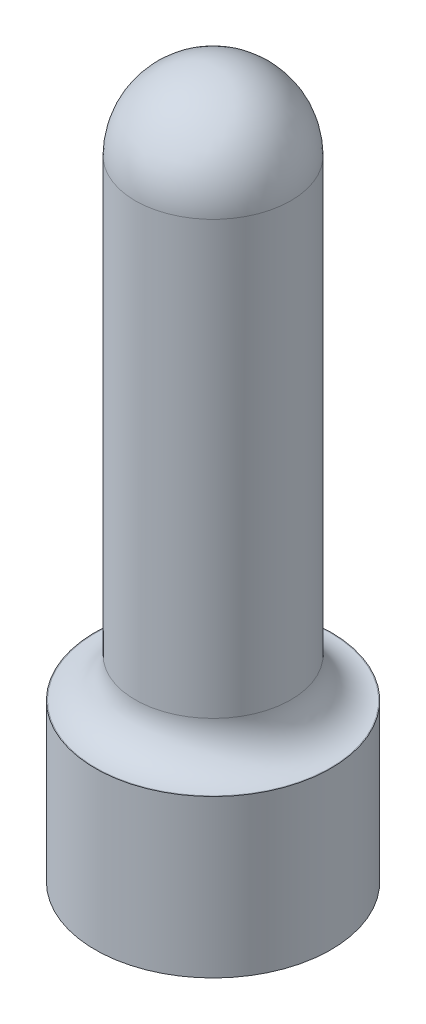
ISO-10303-21;
HEADER;
FILE_DESCRIPTION(('STEP AP214'),'2;1');
FILE_NAME('part.step','',(''),(''),'','','');
FILE_SCHEMA(('AUTOMOTIVE_DESIGN { 1 0 10303 214 1 1 1 1 }'));
ENDSEC;
DATA;
#1=APPLICATION_CONTEXT('core data for automotive mechanical design processes');
#2=APPLICATION_PROTOCOL_DEFINITION('international standard','automotive_design',2000,#1);
#3=PRODUCT_CONTEXT('',#1,'mechanical');
#4=PRODUCT('Part','Part','',(#3));
#5=PRODUCT_RELATED_PRODUCT_CATEGORY('part','',(#4));
#6=PRODUCT_DEFINITION_FORMATION('','',#4);
#7=PRODUCT_DEFINITION_CONTEXT('part definition',#1,'design');
#8=PRODUCT_DEFINITION('design','',#6,#7);
#9=PRODUCT_DEFINITION_SHAPE('','',#8);
#10=(LENGTH_UNIT() NAMED_UNIT(*) SI_UNIT(.MILLI.,.METRE.));
#11=(NAMED_UNIT(*) PLANE_ANGLE_UNIT() SI_UNIT($,.RADIAN.));
#12=(NAMED_UNIT(*) SI_UNIT($,.STERADIAN.) SOLID_ANGLE_UNIT());
#13=UNCERTAINTY_MEASURE_WITH_UNIT(LENGTH_MEASURE(1.E-05),#10,'distance_accuracy_value','');
#14=(GEOMETRIC_REPRESENTATION_CONTEXT(3) GLOBAL_UNCERTAINTY_ASSIGNED_CONTEXT((#13)) GLOBAL_UNIT_ASSIGNED_CONTEXT((#10,
#11,#12)) REPRESENTATION_CONTEXT('',''));
#15=CARTESIAN_POINT('',(0.,0.,0.));
#16=DIRECTION('',(0.,0.,1.));
#17=DIRECTION('',(1.,0.,0.));
#18=AXIS2_PLACEMENT_3D('',#15,#16,#17);
#19=CARTESIAN_POINT('',(0.,80.,0.));
#20=DIRECTION('',(0.,-1.,0.));
#21=DIRECTION('',(0.,0.,-1.));
#22=AXIS2_PLACEMENT_3D('',#19,#20,#21);
#23=CYLINDRICAL_SURFACE('',#22,9.9);
#24=CARTESIAN_POINT('',(0.,25.,0.));
#25=DIRECTION('',(0.,-1.,0.));
#26=DIRECTION('',(0.,0.,-1.));
#27=AXIS2_PLACEMENT_3D('',#24,#25,#26);
#28=CIRCLE('',#27,9.9);
#29=CARTESIAN_POINT('',(0.,25.,-9.9));
#30=VERTEX_POINT('',#29);
#31=EDGE_CURVE('E10',#30,#30,#28,.F.);
#32=ORIENTED_EDGE('',*,*,#31,.T.);
#33=EDGE_LOOP('',(#32));
#34=FACE_BOUND('',#33,.T.);
#35=CARTESIAN_POINT('',(0.,80.,0.));
#36=DIRECTION('',(0.,1.,0.));
#37=DIRECTION('',(0.,0.,1.));
#38=AXIS2_PLACEMENT_3D('',#35,#36,#37);
#39=CIRCLE('',#38,9.9);
#40=CARTESIAN_POINT('',(0.,80.,9.9));
#41=VERTEX_POINT('',#40);
#42=EDGE_CURVE('E47',#41,#41,#39,.T.);
#43=ORIENTED_EDGE('',*,*,#42,.F.);
#44=EDGE_LOOP('',(#43));
#45=FACE_BOUND('',#44,.T.);
#46=ADVANCED_FACE('F36',(#34,#45),#23,.T.);
#47=CARTESIAN_POINT('',(0.,80.,0.));
#48=DIRECTION('',(-1.,0.,0.));
#49=DIRECTION('',(0.,1.,0.));
#50=AXIS2_PLACEMENT_3D('',#47,#48,#49);
#51=SPHERICAL_SURFACE('',#50,9.9);
#52=CARTESIAN_POINT('',(0.,80.,0.));
#53=DIRECTION('',(0.,1.,0.));
#54=DIRECTION('',(0.,0.,1.));
#55=AXIS2_PLACEMENT_3D('',#52,#53,#54);
#56=SPHERICAL_SURFACE('',#55,9.9);
#57=ORIENTED_EDGE('',*,*,#42,.T.);
#58=EDGE_LOOP('',(#57));
#59=FACE_BOUND('',#58,.T.);
#60=ADVANCED_FACE('F73',(#59),#56,.T.);
#61=CARTESIAN_POINT('',(0.,20.,0.));
#62=DIRECTION('',(0.,-1.,0.));
#63=DIRECTION('',(0.,0.,-1.));
#64=AXIS2_PLACEMENT_3D('',#61,#62,#63);
#65=CYLINDRICAL_SURFACE('',#64,15.);
#66=CARTESIAN_POINT('',(0.,20.,0.));
#67=DIRECTION('',(0.,-1.,0.));
#68=DIRECTION('',(0.,0.,-1.));
#69=AXIS2_PLACEMENT_3D('',#66,#67,#68);
#70=CIRCLE('',#69,15.);
#71=CARTESIAN_POINT('',(0.,20.,-15.));
#72=VERTEX_POINT('',#71);
#73=EDGE_CURVE('E51',#72,#72,#70,.T.);
#74=ORIENTED_EDGE('',*,*,#73,.T.);
#75=EDGE_LOOP('',(#74));
#76=FACE_BOUND('',#75,.T.);
#77=CARTESIAN_POINT('',(0.,0.,0.));
#78=DIRECTION('',(0.,-1.,0.));
#79=DIRECTION('',(0.,0.,-1.));
#80=AXIS2_PLACEMENT_3D('',#77,#78,#79);
#81=CIRCLE('',#80,15.);
#82=CARTESIAN_POINT('',(0.,0.,-15.));
#83=VERTEX_POINT('',#82);
#84=EDGE_CURVE('E54',#83,#83,#81,.T.);
#85=ORIENTED_EDGE('',*,*,#84,.F.);
#86=EDGE_LOOP('',(#85));
#87=FACE_BOUND('',#86,.T.);
#88=ADVANCED_FACE('F60',(#76,#87),#65,.T.);
#89=CARTESIAN_POINT('',(0.,20.,0.));
#90=DIRECTION('',(0.,-1.,0.));
#91=DIRECTION('',(0.,0.,-1.));
#92=AXIS2_PLACEMENT_3D('',#89,#90,#91);
#93=PLANE('',#92);
#94=CARTESIAN_POINT('',(0.,20.,0.));
#95=DIRECTION('',(0.,-1.,0.));
#96=DIRECTION('',(0.,0.,-1.));
#97=AXIS2_PLACEMENT_3D('',#94,#95,#96);
#98=CIRCLE('',#97,14.9);
#99=CARTESIAN_POINT('',(0.,20.,-14.9));
#100=VERTEX_POINT('',#99);
#101=EDGE_CURVE('E43',#100,#100,#98,.T.);
#102=ORIENTED_EDGE('',*,*,#101,.T.);
#103=EDGE_LOOP('',(#102));
#104=FACE_BOUND('',#103,.T.);
#105=ORIENTED_EDGE('',*,*,#73,.F.);
#106=EDGE_LOOP('',(#105));
#107=FACE_BOUND('',#106,.T.);
#108=ADVANCED_FACE('F63',(#104,#107),#93,.F.);
#109=CARTESIAN_POINT('',(0.,0.,0.));
#110=DIRECTION('',(0.,1.,0.));
#111=DIRECTION('',(0.,0.,1.));
#112=AXIS2_PLACEMENT_3D('',#109,#110,#111);
#113=PLANE('',#112);
#114=ORIENTED_EDGE('',*,*,#84,.T.);
#115=EDGE_LOOP('',(#114));
#116=FACE_BOUND('',#115,.T.);
#117=ADVANCED_FACE('F65',(#116),#113,.F.);
#118=CARTESIAN_POINT('',(0.,25.,0.));
#119=DIRECTION('',(0.,-1.,0.));
#120=DIRECTION('',(0.,0.,-1.));
#121=AXIS2_PLACEMENT_3D('',#118,#119,#120);
#122=TOROIDAL_SURFACE('',#121,14.9,5.);
#123=ORIENTED_EDGE('',*,*,#31,.F.);
#124=EDGE_LOOP('',(#123));
#125=FACE_BOUND('',#124,.T.);
#126=ORIENTED_EDGE('',*,*,#101,.F.);
#127=EDGE_LOOP('',(#126));
#128=FACE_BOUND('',#127,.T.);
#129=ADVANCED_FACE('F38',(#125,#128),#122,.F.);
#130=CLOSED_SHELL('',(#46,#60,#88,#108,#117,#129));
#131=MANIFOLD_SOLID_BREP('B2',#130);
#132=ADVANCED_BREP_SHAPE_REPRESENTATION('',(#18,#131),#14);
#133=SHAPE_DEFINITION_REPRESENTATION(#9,#132);
ENDSEC;
END-ISO-10303-21;
